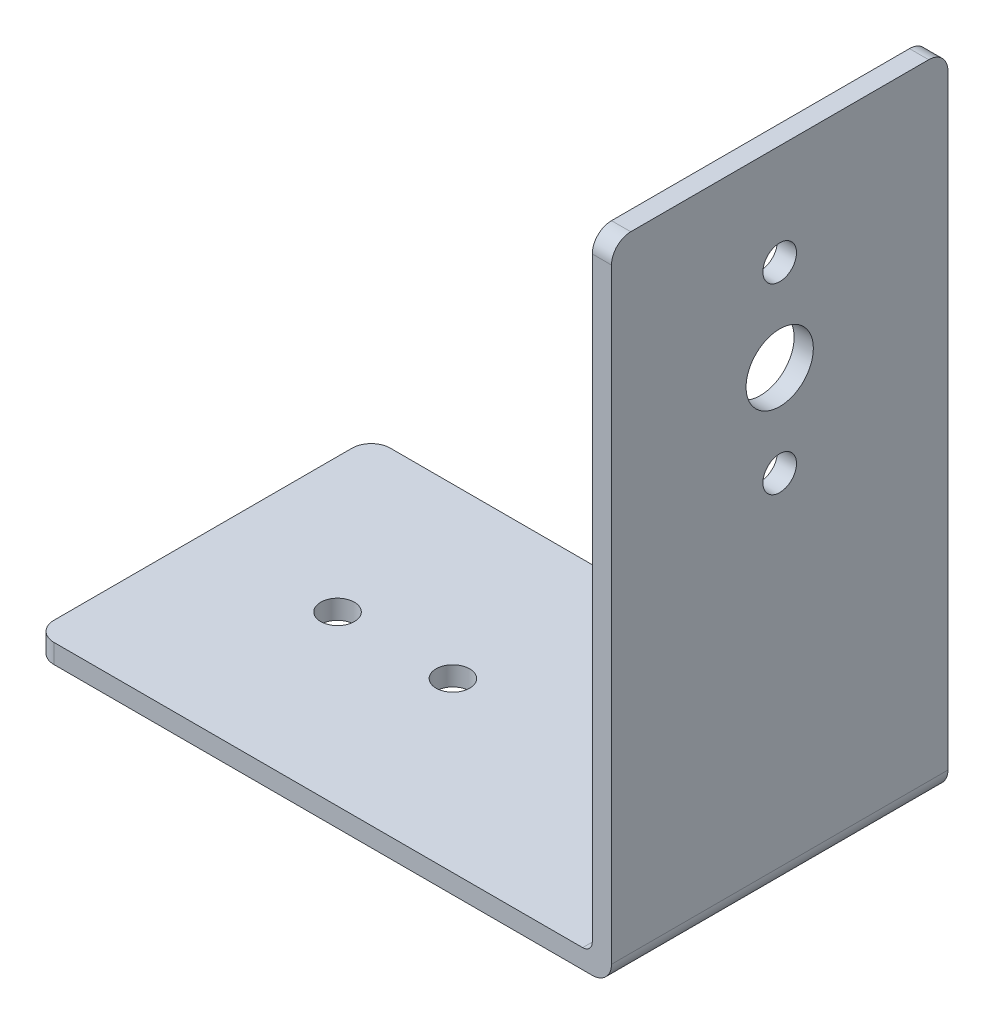
ISO-10303-21;
HEADER;
FILE_DESCRIPTION(('STEP AP214'),'2;1');
FILE_NAME('part.step','',(''),(''),'','','');
FILE_SCHEMA(('AUTOMOTIVE_DESIGN { 1 0 10303 214 1 1 1 1 }'));
ENDSEC;
DATA;
#1=APPLICATION_CONTEXT('core data for automotive mechanical design processes');
#2=APPLICATION_PROTOCOL_DEFINITION('international standard','automotive_design',2000,#1);
#3=PRODUCT_CONTEXT('',#1,'mechanical');
#4=PRODUCT('Part','Part','',(#3));
#5=PRODUCT_RELATED_PRODUCT_CATEGORY('part','',(#4));
#6=PRODUCT_DEFINITION_FORMATION('','',#4);
#7=PRODUCT_DEFINITION_CONTEXT('part definition',#1,'design');
#8=PRODUCT_DEFINITION('design','',#6,#7);
#9=PRODUCT_DEFINITION_SHAPE('','',#8);
#10=(LENGTH_UNIT() NAMED_UNIT(*) SI_UNIT(.MILLI.,.METRE.));
#11=(NAMED_UNIT(*) PLANE_ANGLE_UNIT() SI_UNIT($,.RADIAN.));
#12=(NAMED_UNIT(*) SI_UNIT($,.STERADIAN.) SOLID_ANGLE_UNIT());
#13=UNCERTAINTY_MEASURE_WITH_UNIT(LENGTH_MEASURE(1.E-05),#10,'distance_accuracy_value','');
#14=(GEOMETRIC_REPRESENTATION_CONTEXT(3) GLOBAL_UNCERTAINTY_ASSIGNED_CONTEXT((#13)) GLOBAL_UNIT_ASSIGNED_CONTEXT((#10,
#11,#12)) REPRESENTATION_CONTEXT('',''));
#15=CARTESIAN_POINT('',(0.,0.,0.));
#16=DIRECTION('',(0.,0.,1.));
#17=DIRECTION('',(1.,0.,0.));
#18=AXIS2_PLACEMENT_3D('',#15,#16,#17);
#19=CARTESIAN_POINT('',(60.,0.,35.));
#20=DIRECTION('',(-1.,0.,0.));
#21=DIRECTION('',(0.,0.,1.));
#22=AXIS2_PLACEMENT_3D('',#19,#20,#21);
#23=PLANE('',#22);
#24=CARTESIAN_POINT('',(60.,45.,17.5));
#25=DIRECTION('',(1.,0.,0.));
#26=DIRECTION('',(0.,0.,-1.));
#27=AXIS2_PLACEMENT_3D('',#24,#25,#26);
#28=CIRCLE('',#27,3.50000000000001);
#29=CARTESIAN_POINT('',(60.,45.,14.));
#30=VERTEX_POINT('',#29);
#31=EDGE_CURVE('E258',#30,#30,#28,.T.);
#32=ORIENTED_EDGE('',*,*,#31,.F.);
#33=EDGE_LOOP('',(#32));
#34=FACE_BOUND('',#33,.T.);
#35=CARTESIAN_POINT('',(60.,54.5,17.5));
#36=DIRECTION('',(1.,0.,0.));
#37=DIRECTION('',(0.,0.,-1.));
#38=AXIS2_PLACEMENT_3D('',#35,#36,#37);
#39=CIRCLE('',#38,1.75);
#40=CARTESIAN_POINT('',(60.,54.5,15.75));
#41=VERTEX_POINT('',#40);
#42=EDGE_CURVE('E252',#41,#41,#39,.T.);
#43=ORIENTED_EDGE('',*,*,#42,.F.);
#44=EDGE_LOOP('',(#43));
#45=FACE_BOUND('',#44,.T.);
#46=CARTESIAN_POINT('',(60.,35.5,17.5));
#47=DIRECTION('',(1.,0.,0.));
#48=DIRECTION('',(0.,0.,-1.));
#49=AXIS2_PLACEMENT_3D('',#46,#47,#48);
#50=CIRCLE('',#49,1.75);
#51=CARTESIAN_POINT('',(60.,35.5,15.75));
#52=VERTEX_POINT('',#51);
#53=EDGE_CURVE('E155',#52,#52,#50,.T.);
#54=ORIENTED_EDGE('',*,*,#53,.F.);
#55=EDGE_LOOP('',(#54));
#56=FACE_BOUND('',#55,.T.);
#57=DIRECTION('',(0.,1.,0.));
#58=VECTOR('',#57,1.);
#59=CARTESIAN_POINT('',(60.,0.,0.));
#60=LINE('',#59,#58);
#61=CARTESIAN_POINT('',(60.,0.,0.));
#62=VERTEX_POINT('',#61);
#63=CARTESIAN_POINT('',(60.,63.,0.));
#64=VERTEX_POINT('',#63);
#65=EDGE_CURVE('E139',#62,#64,#60,.T.);
#66=ORIENTED_EDGE('',*,*,#65,.T.);
#67=CARTESIAN_POINT('',(60.,63.,2.));
#68=DIRECTION('',(-1.,0.,0.));
#69=DIRECTION('',(0.,0.,1.));
#70=AXIS2_PLACEMENT_3D('',#67,#68,#69);
#71=CIRCLE('',#70,2.);
#72=CARTESIAN_POINT('',(60.,65.,2.));
#73=VERTEX_POINT('',#72);
#74=EDGE_CURVE('E196',#64,#73,#71,.F.);
#75=ORIENTED_EDGE('',*,*,#74,.T.);
#76=DIRECTION('',(0.,0.,-1.));
#77=VECTOR('',#76,1.);
#78=CARTESIAN_POINT('',(60.,65.,35.));
#79=LINE('',#78,#77);
#80=CARTESIAN_POINT('',(60.,65.,33.));
#81=VERTEX_POINT('',#80);
#82=EDGE_CURVE('E142',#81,#73,#79,.T.);
#83=ORIENTED_EDGE('',*,*,#82,.F.);
#84=CARTESIAN_POINT('',(60.,63.,33.));
#85=DIRECTION('',(-1.,0.,0.));
#86=DIRECTION('',(0.,0.,1.));
#87=AXIS2_PLACEMENT_3D('',#84,#85,#86);
#88=CIRCLE('',#87,2.);
#89=CARTESIAN_POINT('',(60.,63.,35.));
#90=VERTEX_POINT('',#89);
#91=EDGE_CURVE('E189',#81,#90,#88,.F.);
#92=ORIENTED_EDGE('',*,*,#91,.T.);
#93=DIRECTION('',(0.,1.,0.));
#94=VECTOR('',#93,1.);
#95=CARTESIAN_POINT('',(60.,0.,35.));
#96=LINE('',#95,#94);
#97=CARTESIAN_POINT('',(60.,0.,35.));
#98=VERTEX_POINT('',#97);
#99=EDGE_CURVE('E141',#98,#90,#96,.T.);
#100=ORIENTED_EDGE('',*,*,#99,.F.);
#101=DIRECTION('',(0.,0.,-1.));
#102=VECTOR('',#101,1.);
#103=CARTESIAN_POINT('',(60.,0.,35.));
#104=LINE('',#103,#102);
#105=EDGE_CURVE('E129',#98,#62,#104,.T.);
#106=ORIENTED_EDGE('',*,*,#105,.T.);
#107=EDGE_LOOP('',(#66,#75,#83,#92,#100,#106));
#108=FACE_BOUND('',#107,.T.);
#109=ADVANCED_FACE('F37',(#34,#45,#56,#108),#23,.F.);
#110=CARTESIAN_POINT('',(58.,65.,35.));
#111=DIRECTION('',(0.,1.,0.));
#112=DIRECTION('',(0.,0.,1.));
#113=AXIS2_PLACEMENT_3D('',#110,#111,#112);
#114=PLANE('',#113);
#115=ORIENTED_EDGE('',*,*,#82,.T.);
#116=DIRECTION('',(1.,0.,0.));
#117=VECTOR('',#116,1.);
#118=CARTESIAN_POINT('',(58.,65.,2.));
#119=LINE('',#118,#117);
#120=CARTESIAN_POINT('',(58.,65.,2.));
#121=VERTEX_POINT('',#120);
#122=EDGE_CURVE('E198',#73,#121,#119,.F.);
#123=ORIENTED_EDGE('',*,*,#122,.T.);
#124=DIRECTION('',(0.,0.,-1.));
#125=VECTOR('',#124,1.);
#126=CARTESIAN_POINT('',(58.,65.,35.));
#127=LINE('',#126,#125);
#128=CARTESIAN_POINT('',(58.,65.,33.));
#129=VERTEX_POINT('',#128);
#130=EDGE_CURVE('E168',#129,#121,#127,.T.);
#131=ORIENTED_EDGE('',*,*,#130,.F.);
#132=DIRECTION('',(1.,0.,0.));
#133=VECTOR('',#132,1.);
#134=CARTESIAN_POINT('',(60.,65.,33.));
#135=LINE('',#134,#133);
#136=EDGE_CURVE('E186',#129,#81,#135,.T.);
#137=ORIENTED_EDGE('',*,*,#136,.T.);
#138=EDGE_LOOP('',(#115,#123,#131,#137));
#139=FACE_BOUND('',#138,.T.);
#140=ADVANCED_FACE('F300',(#139),#114,.T.);
#141=CARTESIAN_POINT('',(58.,0.,35.));
#142=DIRECTION('',(-1.,0.,0.));
#143=DIRECTION('',(0.,0.,1.));
#144=AXIS2_PLACEMENT_3D('',#141,#142,#143);
#145=PLANE('',#144);
#146=CARTESIAN_POINT('',(58.,45.,17.5));
#147=DIRECTION('',(1.,0.,0.));
#148=DIRECTION('',(0.,0.,-1.));
#149=AXIS2_PLACEMENT_3D('',#146,#147,#148);
#150=CIRCLE('',#149,3.50000000000001);
#151=CARTESIAN_POINT('',(58.,45.,14.));
#152=VERTEX_POINT('',#151);
#153=EDGE_CURVE('E255',#152,#152,#150,.T.);
#154=ORIENTED_EDGE('',*,*,#153,.T.);
#155=EDGE_LOOP('',(#154));
#156=FACE_BOUND('',#155,.T.);
#157=CARTESIAN_POINT('',(58.,54.5,17.5));
#158=DIRECTION('',(1.,0.,0.));
#159=DIRECTION('',(0.,0.,-1.));
#160=AXIS2_PLACEMENT_3D('',#157,#158,#159);
#161=CIRCLE('',#160,1.75);
#162=CARTESIAN_POINT('',(58.,54.5,15.75));
#163=VERTEX_POINT('',#162);
#164=EDGE_CURVE('E250',#163,#163,#161,.T.);
#165=ORIENTED_EDGE('',*,*,#164,.T.);
#166=EDGE_LOOP('',(#165));
#167=FACE_BOUND('',#166,.T.);
#168=CARTESIAN_POINT('',(58.,35.5,17.5));
#169=DIRECTION('',(1.,0.,0.));
#170=DIRECTION('',(0.,0.,-1.));
#171=AXIS2_PLACEMENT_3D('',#168,#169,#170);
#172=CIRCLE('',#171,1.75);
#173=CARTESIAN_POINT('',(58.,35.5,15.75));
#174=VERTEX_POINT('',#173);
#175=EDGE_CURVE('E150',#174,#174,#172,.T.);
#176=ORIENTED_EDGE('',*,*,#175,.T.);
#177=EDGE_LOOP('',(#176));
#178=FACE_BOUND('',#177,.T.);
#179=ORIENTED_EDGE('',*,*,#130,.T.);
#180=CARTESIAN_POINT('',(58.,63.,2.));
#181=DIRECTION('',(-1.,0.,0.));
#182=DIRECTION('',(0.,0.,1.));
#183=AXIS2_PLACEMENT_3D('',#180,#181,#182);
#184=CIRCLE('',#183,2.);
#185=CARTESIAN_POINT('',(58.,63.,0.));
#186=VERTEX_POINT('',#185);
#187=EDGE_CURVE('E200',#121,#186,#184,.T.);
#188=ORIENTED_EDGE('',*,*,#187,.T.);
#189=DIRECTION('',(0.,1.,0.));
#190=VECTOR('',#189,1.);
#191=CARTESIAN_POINT('',(58.,0.,0.));
#192=LINE('',#191,#190);
#193=CARTESIAN_POINT('',(58.,1.,0.));
#194=VERTEX_POINT('',#193);
#195=EDGE_CURVE('E149',#194,#186,#192,.T.);
#196=ORIENTED_EDGE('',*,*,#195,.F.);
#197=DIRECTION('',(0.,0.,-1.));
#198=VECTOR('',#197,1.);
#199=CARTESIAN_POINT('',(58.,1.,35.));
#200=LINE('',#199,#198);
#201=CARTESIAN_POINT('',(58.,1.,35.));
#202=VERTEX_POINT('',#201);
#203=EDGE_CURVE('E179',#194,#202,#200,.F.);
#204=ORIENTED_EDGE('',*,*,#203,.T.);
#205=DIRECTION('',(0.,1.,0.));
#206=VECTOR('',#205,1.);
#207=CARTESIAN_POINT('',(58.,0.,35.));
#208=LINE('',#207,#206);
#209=CARTESIAN_POINT('',(58.,63.,35.));
#210=VERTEX_POINT('',#209);
#211=EDGE_CURVE('E239',#202,#210,#208,.T.);
#212=ORIENTED_EDGE('',*,*,#211,.T.);
#213=CARTESIAN_POINT('',(58.,63.,33.));
#214=DIRECTION('',(-1.,0.,0.));
#215=DIRECTION('',(0.,0.,1.));
#216=AXIS2_PLACEMENT_3D('',#213,#214,#215);
#217=CIRCLE('',#216,2.);
#218=EDGE_CURVE('E193',#210,#129,#217,.T.);
#219=ORIENTED_EDGE('',*,*,#218,.T.);
#220=EDGE_LOOP('',(#179,#188,#196,#204,#212,#219));
#221=FACE_BOUND('',#220,.T.);
#222=ADVANCED_FACE('F287',(#156,#167,#178,#221),#145,.T.);
#223=CARTESIAN_POINT('',(0.,0.,35.));
#224=DIRECTION('',(0.,1.,0.));
#225=DIRECTION('',(0.,0.,1.));
#226=AXIS2_PLACEMENT_3D('',#223,#224,#225);
#227=PLANE('',#226);
#228=CARTESIAN_POINT('',(14.,0.,17.5));
#229=DIRECTION('',(0.,1.,0.));
#230=DIRECTION('',(0.,0.,1.));
#231=AXIS2_PLACEMENT_3D('',#228,#229,#230);
#232=CIRCLE('',#231,1.75);
#233=CARTESIAN_POINT('',(14.,0.,19.25));
#234=VERTEX_POINT('',#233);
#235=EDGE_CURVE('E270',#234,#234,#232,.T.);
#236=ORIENTED_EDGE('',*,*,#235,.F.);
#237=EDGE_LOOP('',(#236));
#238=FACE_BOUND('',#237,.T.);
#239=CARTESIAN_POINT('',(26.,0.,17.5));
#240=DIRECTION('',(0.,1.,0.));
#241=DIRECTION('',(0.,0.,1.));
#242=AXIS2_PLACEMENT_3D('',#239,#240,#241);
#243=CIRCLE('',#242,1.74999999999999);
#244=CARTESIAN_POINT('',(26.,0.,19.25));
#245=VERTEX_POINT('',#244);
#246=EDGE_CURVE('E264',#245,#245,#243,.T.);
#247=ORIENTED_EDGE('',*,*,#246,.F.);
#248=EDGE_LOOP('',(#247));
#249=FACE_BOUND('',#248,.T.);
#250=DIRECTION('',(0.,0.,-1.));
#251=VECTOR('',#250,1.);
#252=CARTESIAN_POINT('',(0.,0.,35.));
#253=LINE('',#252,#251);
#254=CARTESIAN_POINT('',(0.,0.,33.));
#255=VERTEX_POINT('',#254);
#256=CARTESIAN_POINT('',(0.,0.,2.));
#257=VERTEX_POINT('',#256);
#258=EDGE_CURVE('E166',#255,#257,#253,.T.);
#259=ORIENTED_EDGE('',*,*,#258,.F.);
#260=CARTESIAN_POINT('',(2.,0.,33.));
#261=DIRECTION('',(0.,1.,0.));
#262=DIRECTION('',(0.,0.,1.));
#263=AXIS2_PLACEMENT_3D('',#260,#261,#262);
#264=CIRCLE('',#263,2.);
#265=CARTESIAN_POINT('',(2.,0.,35.));
#266=VERTEX_POINT('',#265);
#267=EDGE_CURVE('E59',#255,#266,#264,.T.);
#268=ORIENTED_EDGE('',*,*,#267,.T.);
#269=DIRECTION('',(1.,0.,0.));
#270=VECTOR('',#269,1.);
#271=CARTESIAN_POINT('',(0.,0.,35.));
#272=LINE('',#271,#270);
#273=CARTESIAN_POINT('',(57.,0.,35.));
#274=VERTEX_POINT('',#273);
#275=EDGE_CURVE('E238',#266,#274,#272,.T.);
#276=ORIENTED_EDGE('',*,*,#275,.T.);
#277=DIRECTION('',(0.,0.,-1.));
#278=VECTOR('',#277,1.);
#279=CARTESIAN_POINT('',(57.,0.,0.));
#280=LINE('',#279,#278);
#281=CARTESIAN_POINT('',(57.,0.,0.));
#282=VERTEX_POINT('',#281);
#283=EDGE_CURVE('E176',#274,#282,#280,.T.);
#284=ORIENTED_EDGE('',*,*,#283,.T.);
#285=DIRECTION('',(1.,0.,0.));
#286=VECTOR('',#285,1.);
#287=CARTESIAN_POINT('',(0.,0.,0.));
#288=LINE('',#287,#286);
#289=CARTESIAN_POINT('',(2.,0.,0.));
#290=VERTEX_POINT('',#289);
#291=EDGE_CURVE('E152',#290,#282,#288,.T.);
#292=ORIENTED_EDGE('',*,*,#291,.F.);
#293=CARTESIAN_POINT('',(2.,0.,2.));
#294=DIRECTION('',(0.,1.,0.));
#295=DIRECTION('',(0.,0.,1.));
#296=AXIS2_PLACEMENT_3D('',#293,#294,#295);
#297=CIRCLE('',#296,2.);
#298=EDGE_CURVE('E205',#290,#257,#297,.T.);
#299=ORIENTED_EDGE('',*,*,#298,.T.);
#300=EDGE_LOOP('',(#259,#268,#276,#284,#292,#299));
#301=FACE_BOUND('',#300,.T.);
#302=ADVANCED_FACE('F222',(#238,#249,#301),#227,.T.);
#303=CARTESIAN_POINT('',(0.,-2.,35.));
#304=DIRECTION('',(-1.,0.,0.));
#305=DIRECTION('',(0.,0.,1.));
#306=AXIS2_PLACEMENT_3D('',#303,#304,#305);
#307=PLANE('',#306);
#308=DIRECTION('',(0.,0.,-1.));
#309=VECTOR('',#308,1.);
#310=CARTESIAN_POINT('',(0.,-2.,35.));
#311=LINE('',#310,#309);
#312=CARTESIAN_POINT('',(0.,-2.,33.));
#313=VERTEX_POINT('',#312);
#314=CARTESIAN_POINT('',(0.,-2.,2.));
#315=VERTEX_POINT('',#314);
#316=EDGE_CURVE('E164',#313,#315,#311,.T.);
#317=ORIENTED_EDGE('',*,*,#316,.F.);
#318=DIRECTION('',(0.,1.,0.));
#319=VECTOR('',#318,1.);
#320=CARTESIAN_POINT('',(0.,0.,33.));
#321=LINE('',#320,#319);
#322=EDGE_CURVE('E213',#313,#255,#321,.T.);
#323=ORIENTED_EDGE('',*,*,#322,.T.);
#324=ORIENTED_EDGE('',*,*,#258,.T.);
#325=DIRECTION('',(0.,1.,0.));
#326=VECTOR('',#325,1.);
#327=CARTESIAN_POINT('',(0.,-2.,2.));
#328=LINE('',#327,#326);
#329=EDGE_CURVE('E208',#257,#315,#328,.F.);
#330=ORIENTED_EDGE('',*,*,#329,.T.);
#331=EDGE_LOOP('',(#317,#323,#324,#330));
#332=FACE_BOUND('',#331,.T.);
#333=ADVANCED_FACE('F219',(#332),#307,.T.);
#334=CARTESIAN_POINT('',(0.,-2.,35.));
#335=DIRECTION('',(0.,1.,0.));
#336=DIRECTION('',(0.,0.,1.));
#337=AXIS2_PLACEMENT_3D('',#334,#335,#336);
#338=PLANE('',#337);
#339=CARTESIAN_POINT('',(14.,-2.,17.5));
#340=DIRECTION('',(0.,1.,0.));
#341=DIRECTION('',(0.,0.,1.));
#342=AXIS2_PLACEMENT_3D('',#339,#340,#341);
#343=CIRCLE('',#342,1.75);
#344=CARTESIAN_POINT('',(14.,-2.,19.25));
#345=VERTEX_POINT('',#344);
#346=EDGE_CURVE('E267',#345,#345,#343,.T.);
#347=ORIENTED_EDGE('',*,*,#346,.T.);
#348=EDGE_LOOP('',(#347));
#349=FACE_BOUND('',#348,.T.);
#350=CARTESIAN_POINT('',(26.,-2.,17.5));
#351=DIRECTION('',(0.,1.,0.));
#352=DIRECTION('',(0.,0.,1.));
#353=AXIS2_PLACEMENT_3D('',#350,#351,#352);
#354=CIRCLE('',#353,1.74999999999999);
#355=CARTESIAN_POINT('',(26.,-2.,19.25));
#356=VERTEX_POINT('',#355);
#357=EDGE_CURVE('E261',#356,#356,#354,.T.);
#358=ORIENTED_EDGE('',*,*,#357,.T.);
#359=EDGE_LOOP('',(#358));
#360=FACE_BOUND('',#359,.T.);
#361=DIRECTION('',(1.,0.,0.));
#362=VECTOR('',#361,1.);
#363=CARTESIAN_POINT('',(0.,-2.,35.));
#364=LINE('',#363,#362);
#365=CARTESIAN_POINT('',(2.,-2.,35.));
#366=VERTEX_POINT('',#365);
#367=CARTESIAN_POINT('',(58.,-2.,35.));
#368=VERTEX_POINT('',#367);
#369=EDGE_CURVE('E158',#366,#368,#364,.T.);
#370=ORIENTED_EDGE('',*,*,#369,.F.);
#371=CARTESIAN_POINT('',(2.,-2.,33.));
#372=DIRECTION('',(0.,1.,0.));
#373=DIRECTION('',(0.,0.,1.));
#374=AXIS2_PLACEMENT_3D('',#371,#372,#373);
#375=CIRCLE('',#374,2.);
#376=EDGE_CURVE('E11',#366,#313,#375,.F.);
#377=ORIENTED_EDGE('',*,*,#376,.T.);
#378=ORIENTED_EDGE('',*,*,#316,.T.);
#379=CARTESIAN_POINT('',(2.,-2.,2.));
#380=DIRECTION('',(0.,1.,0.));
#381=DIRECTION('',(0.,0.,1.));
#382=AXIS2_PLACEMENT_3D('',#379,#380,#381);
#383=CIRCLE('',#382,2.);
#384=CARTESIAN_POINT('',(2.,-2.,0.));
#385=VERTEX_POINT('',#384);
#386=EDGE_CURVE('E211',#315,#385,#383,.F.);
#387=ORIENTED_EDGE('',*,*,#386,.T.);
#388=DIRECTION('',(1.,0.,0.));
#389=VECTOR('',#388,1.);
#390=CARTESIAN_POINT('',(0.,-2.,0.));
#391=LINE('',#390,#389);
#392=CARTESIAN_POINT('',(58.,-2.,0.));
#393=VERTEX_POINT('',#392);
#394=EDGE_CURVE('E162',#385,#393,#391,.T.);
#395=ORIENTED_EDGE('',*,*,#394,.T.);
#396=DIRECTION('',(0.,0.,-1.));
#397=VECTOR('',#396,1.);
#398=CARTESIAN_POINT('',(58.,-2.,35.));
#399=LINE('',#398,#397);
#400=EDGE_CURVE('E131',#393,#368,#399,.F.);
#401=ORIENTED_EDGE('',*,*,#400,.T.);
#402=EDGE_LOOP('',(#370,#377,#378,#387,#395,#401));
#403=FACE_BOUND('',#402,.T.);
#404=ADVANCED_FACE('F230',(#349,#360,#403),#338,.F.);
#405=CARTESIAN_POINT('',(0.,0.,35.));
#406=DIRECTION('',(0.,0.,-1.));
#407=DIRECTION('',(-1.,0.,0.));
#408=AXIS2_PLACEMENT_3D('',#405,#406,#407);
#409=PLANE('',#408);
#410=ORIENTED_EDGE('',*,*,#275,.F.);
#411=DIRECTION('',(0.,1.,0.));
#412=VECTOR('',#411,1.);
#413=CARTESIAN_POINT('',(2.,-2.,35.));
#414=LINE('',#413,#412);
#415=EDGE_CURVE('E45',#266,#366,#414,.F.);
#416=ORIENTED_EDGE('',*,*,#415,.T.);
#417=ORIENTED_EDGE('',*,*,#369,.T.);
#418=CARTESIAN_POINT('',(58.,0.,35.));
#419=DIRECTION('',(0.,0.,-1.));
#420=DIRECTION('',(-1.,0.,0.));
#421=AXIS2_PLACEMENT_3D('',#418,#419,#420);
#422=CIRCLE('',#421,2.);
#423=EDGE_CURVE('E174',#368,#98,#422,.F.);
#424=ORIENTED_EDGE('',*,*,#423,.T.);
#425=ORIENTED_EDGE('',*,*,#99,.T.);
#426=DIRECTION('',(1.,0.,0.));
#427=VECTOR('',#426,1.);
#428=CARTESIAN_POINT('',(58.,63.,35.));
#429=LINE('',#428,#427);
#430=EDGE_CURVE('E191',#90,#210,#429,.F.);
#431=ORIENTED_EDGE('',*,*,#430,.T.);
#432=ORIENTED_EDGE('',*,*,#211,.F.);
#433=CARTESIAN_POINT('',(57.,1.,35.));
#434=DIRECTION('',(0.,0.,-1.));
#435=DIRECTION('',(-1.,0.,0.));
#436=AXIS2_PLACEMENT_3D('',#433,#434,#435);
#437=CIRCLE('',#436,1.);
#438=EDGE_CURVE('E183',#202,#274,#437,.T.);
#439=ORIENTED_EDGE('',*,*,#438,.T.);
#440=EDGE_LOOP('',(#410,#416,#417,#424,#425,#431,#432,#439));
#441=FACE_BOUND('',#440,.T.);
#442=ADVANCED_FACE('F241',(#441),#409,.F.);
#443=CARTESIAN_POINT('',(0.,0.,0.));
#444=DIRECTION('',(0.,0.,-1.));
#445=DIRECTION('',(-1.,0.,0.));
#446=AXIS2_PLACEMENT_3D('',#443,#444,#445);
#447=PLANE('',#446);
#448=ORIENTED_EDGE('',*,*,#394,.F.);
#449=DIRECTION('',(0.,1.,0.));
#450=VECTOR('',#449,1.);
#451=CARTESIAN_POINT('',(2.,0.,0.));
#452=LINE('',#451,#450);
#453=EDGE_CURVE('E202',#385,#290,#452,.T.);
#454=ORIENTED_EDGE('',*,*,#453,.T.);
#455=ORIENTED_EDGE('',*,*,#291,.T.);
#456=CARTESIAN_POINT('',(57.,1.,0.));
#457=DIRECTION('',(0.,0.,-1.));
#458=DIRECTION('',(-1.,0.,0.));
#459=AXIS2_PLACEMENT_3D('',#456,#457,#458);
#460=CIRCLE('',#459,1.);
#461=EDGE_CURVE('E181',#282,#194,#460,.F.);
#462=ORIENTED_EDGE('',*,*,#461,.T.);
#463=ORIENTED_EDGE('',*,*,#195,.T.);
#464=DIRECTION('',(1.,0.,0.));
#465=VECTOR('',#464,1.);
#466=CARTESIAN_POINT('',(0.,63.,0.));
#467=LINE('',#466,#465);
#468=EDGE_CURVE('E148',#186,#64,#467,.T.);
#469=ORIENTED_EDGE('',*,*,#468,.T.);
#470=ORIENTED_EDGE('',*,*,#65,.F.);
#471=CARTESIAN_POINT('',(58.,0.,0.));
#472=DIRECTION('',(0.,0.,-1.));
#473=DIRECTION('',(-1.,0.,0.));
#474=AXIS2_PLACEMENT_3D('',#471,#472,#473);
#475=CIRCLE('',#474,2.);
#476=EDGE_CURVE('E125',#62,#393,#475,.T.);
#477=ORIENTED_EDGE('',*,*,#476,.T.);
#478=EDGE_LOOP('',(#448,#454,#455,#462,#463,#469,#470,#477));
#479=FACE_BOUND('',#478,.T.);
#480=ADVANCED_FACE('F145',(#479),#447,.T.);
#481=CARTESIAN_POINT('',(58.,0.,35.));
#482=DIRECTION('',(0.,0.,-1.));
#483=DIRECTION('',(-1.,0.,0.));
#484=AXIS2_PLACEMENT_3D('',#481,#482,#483);
#485=CYLINDRICAL_SURFACE('',#484,2.);
#486=ORIENTED_EDGE('',*,*,#423,.F.);
#487=ORIENTED_EDGE('',*,*,#400,.F.);
#488=ORIENTED_EDGE('',*,*,#476,.F.);
#489=ORIENTED_EDGE('',*,*,#105,.F.);
#490=EDGE_LOOP('',(#486,#487,#488,#489));
#491=FACE_BOUND('',#490,.T.);
#492=ADVANCED_FACE('F128',(#491),#485,.T.);
#493=CARTESIAN_POINT('',(57.,1.,35.));
#494=DIRECTION('',(0.,0.,1.));
#495=DIRECTION('',(1.,0.,0.));
#496=AXIS2_PLACEMENT_3D('',#493,#494,#495);
#497=CYLINDRICAL_SURFACE('',#496,1.);
#498=ORIENTED_EDGE('',*,*,#438,.F.);
#499=ORIENTED_EDGE('',*,*,#203,.F.);
#500=ORIENTED_EDGE('',*,*,#461,.F.);
#501=ORIENTED_EDGE('',*,*,#283,.F.);
#502=EDGE_LOOP('',(#498,#499,#500,#501));
#503=FACE_BOUND('',#502,.T.);
#504=ADVANCED_FACE('F237',(#503),#497,.F.);
#505=CARTESIAN_POINT('',(58.,35.5,17.5));
#506=DIRECTION('',(1.,0.,0.));
#507=DIRECTION('',(0.,0.,-1.));
#508=AXIS2_PLACEMENT_3D('',#505,#506,#507);
#509=CYLINDRICAL_SURFACE('',#508,1.75);
#510=ORIENTED_EDGE('',*,*,#175,.F.);
#511=EDGE_LOOP('',(#510));
#512=FACE_BOUND('',#511,.T.);
#513=ORIENTED_EDGE('',*,*,#53,.T.);
#514=EDGE_LOOP('',(#513));
#515=FACE_BOUND('',#514,.T.);
#516=ADVANCED_FACE('F316',(#512,#515),#509,.F.);
#517=CARTESIAN_POINT('',(58.,54.5,17.5));
#518=DIRECTION('',(1.,0.,0.));
#519=DIRECTION('',(0.,0.,-1.));
#520=AXIS2_PLACEMENT_3D('',#517,#518,#519);
#521=CYLINDRICAL_SURFACE('',#520,1.75);
#522=ORIENTED_EDGE('',*,*,#164,.F.);
#523=EDGE_LOOP('',(#522));
#524=FACE_BOUND('',#523,.T.);
#525=ORIENTED_EDGE('',*,*,#42,.T.);
#526=EDGE_LOOP('',(#525));
#527=FACE_BOUND('',#526,.T.);
#528=ADVANCED_FACE('F392',(#524,#527),#521,.F.);
#529=CARTESIAN_POINT('',(58.,45.,17.5));
#530=DIRECTION('',(1.,0.,0.));
#531=DIRECTION('',(0.,0.,-1.));
#532=AXIS2_PLACEMENT_3D('',#529,#530,#531);
#533=CYLINDRICAL_SURFACE('',#532,3.50000000000001);
#534=ORIENTED_EDGE('',*,*,#153,.F.);
#535=EDGE_LOOP('',(#534));
#536=FACE_BOUND('',#535,.T.);
#537=ORIENTED_EDGE('',*,*,#31,.T.);
#538=EDGE_LOOP('',(#537));
#539=FACE_BOUND('',#538,.T.);
#540=ADVANCED_FACE('F321',(#536,#539),#533,.F.);
#541=CARTESIAN_POINT('',(58.,63.,33.));
#542=DIRECTION('',(-1.,0.,0.));
#543=DIRECTION('',(0.,0.,1.));
#544=AXIS2_PLACEMENT_3D('',#541,#542,#543);
#545=CYLINDRICAL_SURFACE('',#544,2.);
#546=ORIENTED_EDGE('',*,*,#218,.F.);
#547=ORIENTED_EDGE('',*,*,#430,.F.);
#548=ORIENTED_EDGE('',*,*,#91,.F.);
#549=ORIENTED_EDGE('',*,*,#136,.F.);
#550=EDGE_LOOP('',(#546,#547,#548,#549));
#551=FACE_BOUND('',#550,.T.);
#552=ADVANCED_FACE('F317',(#551),#545,.T.);
#553=CARTESIAN_POINT('',(0.,63.,2.));
#554=DIRECTION('',(1.,0.,0.));
#555=DIRECTION('',(0.,0.,-1.));
#556=AXIS2_PLACEMENT_3D('',#553,#554,#555);
#557=CYLINDRICAL_SURFACE('',#556,2.);
#558=ORIENTED_EDGE('',*,*,#187,.F.);
#559=ORIENTED_EDGE('',*,*,#122,.F.);
#560=ORIENTED_EDGE('',*,*,#74,.F.);
#561=ORIENTED_EDGE('',*,*,#468,.F.);
#562=EDGE_LOOP('',(#558,#559,#560,#561));
#563=FACE_BOUND('',#562,.T.);
#564=ADVANCED_FACE('F320',(#563),#557,.T.);
#565=CARTESIAN_POINT('',(2.,0.,2.));
#566=DIRECTION('',(0.,1.,0.));
#567=DIRECTION('',(0.,0.,1.));
#568=AXIS2_PLACEMENT_3D('',#565,#566,#567);
#569=CYLINDRICAL_SURFACE('',#568,2.);
#570=ORIENTED_EDGE('',*,*,#386,.F.);
#571=ORIENTED_EDGE('',*,*,#329,.F.);
#572=ORIENTED_EDGE('',*,*,#298,.F.);
#573=ORIENTED_EDGE('',*,*,#453,.F.);
#574=EDGE_LOOP('',(#570,#571,#572,#573));
#575=FACE_BOUND('',#574,.T.);
#576=ADVANCED_FACE('F228',(#575),#569,.T.);
#577=CARTESIAN_POINT('',(2.,-2.,33.));
#578=DIRECTION('',(0.,-1.,0.));
#579=DIRECTION('',(0.,0.,-1.));
#580=AXIS2_PLACEMENT_3D('',#577,#578,#579);
#581=CYLINDRICAL_SURFACE('',#580,2.);
#582=ORIENTED_EDGE('',*,*,#376,.F.);
#583=ORIENTED_EDGE('',*,*,#415,.F.);
#584=ORIENTED_EDGE('',*,*,#267,.F.);
#585=ORIENTED_EDGE('',*,*,#322,.F.);
#586=EDGE_LOOP('',(#582,#583,#584,#585));
#587=FACE_BOUND('',#586,.T.);
#588=ADVANCED_FACE('F39',(#587),#581,.T.);
#589=CARTESIAN_POINT('',(26.,-2.,17.5));
#590=DIRECTION('',(0.,1.,0.));
#591=DIRECTION('',(0.,0.,1.));
#592=AXIS2_PLACEMENT_3D('',#589,#590,#591);
#593=CYLINDRICAL_SURFACE('',#592,1.74999999999999);
#594=ORIENTED_EDGE('',*,*,#357,.F.);
#595=EDGE_LOOP('',(#594));
#596=FACE_BOUND('',#595,.T.);
#597=ORIENTED_EDGE('',*,*,#246,.T.);
#598=EDGE_LOOP('',(#597));
#599=FACE_BOUND('',#598,.T.);
#600=ADVANCED_FACE('F281',(#596,#599),#593,.F.);
#601=CARTESIAN_POINT('',(14.,-2.,17.5));
#602=DIRECTION('',(0.,1.,0.));
#603=DIRECTION('',(0.,0.,1.));
#604=AXIS2_PLACEMENT_3D('',#601,#602,#603);
#605=CYLINDRICAL_SURFACE('',#604,1.75);
#606=ORIENTED_EDGE('',*,*,#346,.F.);
#607=EDGE_LOOP('',(#606));
#608=FACE_BOUND('',#607,.T.);
#609=ORIENTED_EDGE('',*,*,#235,.T.);
#610=EDGE_LOOP('',(#609));
#611=FACE_BOUND('',#610,.T.);
#612=ADVANCED_FACE('F278',(#608,#611),#605,.F.);
#613=CLOSED_SHELL('',(#109,#140,#222,#302,#333,#404,#442,#480,#492,#504,#516,#528,#540,#552,
#564,#576,#588,#600,#612));
#614=MANIFOLD_SOLID_BREP('B2',#613);
#615=ADVANCED_BREP_SHAPE_REPRESENTATION('',(#18,#614),#14);
#616=SHAPE_DEFINITION_REPRESENTATION(#9,#615);
ENDSEC;
END-ISO-10303-21;
